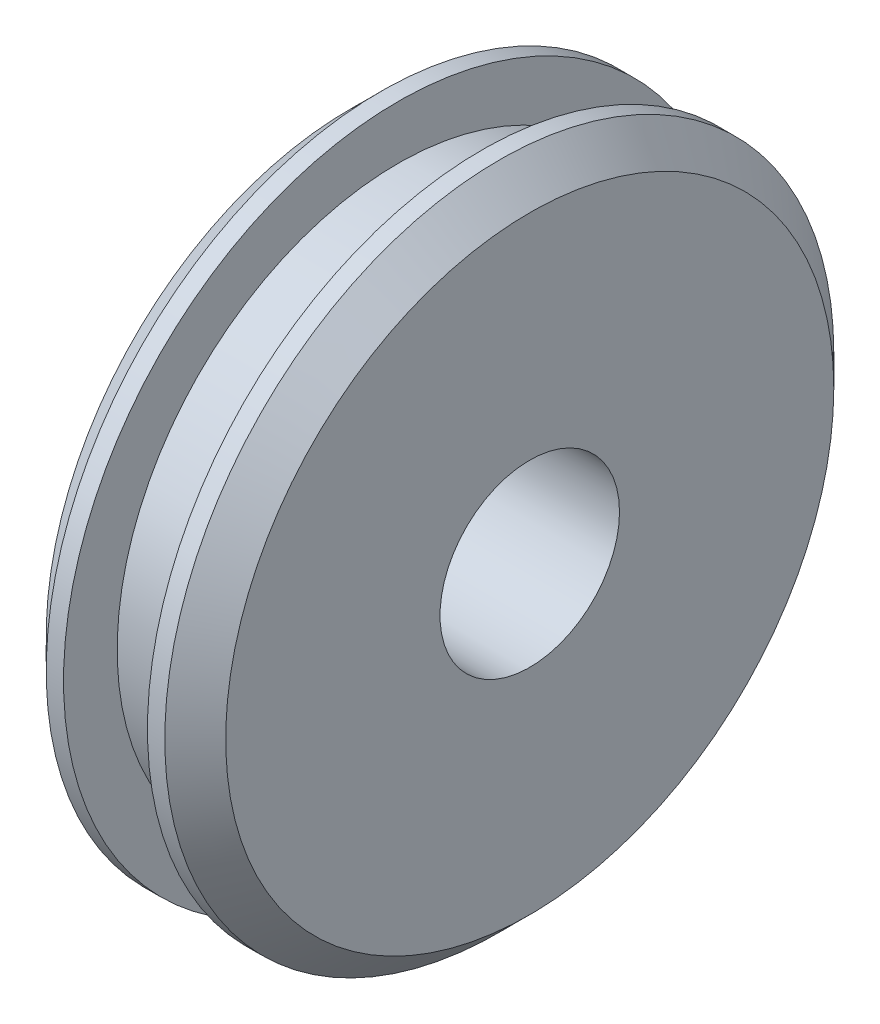
ISO-10303-21;
HEADER;
FILE_DESCRIPTION(('STEP AP214'),'2;1');
FILE_NAME('part.step','',(''),(''),'','','');
FILE_SCHEMA(('AUTOMOTIVE_DESIGN { 1 0 10303 214 1 1 1 1 }'));
ENDSEC;
DATA;
#1=APPLICATION_CONTEXT('core data for automotive mechanical design processes');
#2=APPLICATION_PROTOCOL_DEFINITION('international standard','automotive_design',2000,#1);
#3=PRODUCT_CONTEXT('',#1,'mechanical');
#4=PRODUCT('Part','Part','',(#3));
#5=PRODUCT_RELATED_PRODUCT_CATEGORY('part','',(#4));
#6=PRODUCT_DEFINITION_FORMATION('','',#4);
#7=PRODUCT_DEFINITION_CONTEXT('part definition',#1,'design');
#8=PRODUCT_DEFINITION('design','',#6,#7);
#9=PRODUCT_DEFINITION_SHAPE('','',#8);
#10=(LENGTH_UNIT() NAMED_UNIT(*) SI_UNIT(.MILLI.,.METRE.));
#11=(NAMED_UNIT(*) PLANE_ANGLE_UNIT() SI_UNIT($,.RADIAN.));
#12=(NAMED_UNIT(*) SI_UNIT($,.STERADIAN.) SOLID_ANGLE_UNIT());
#13=UNCERTAINTY_MEASURE_WITH_UNIT(LENGTH_MEASURE(1.E-05),#10,'distance_accuracy_value','');
#14=(GEOMETRIC_REPRESENTATION_CONTEXT(3) GLOBAL_UNCERTAINTY_ASSIGNED_CONTEXT((#13)) GLOBAL_UNIT_ASSIGNED_CONTEXT((#10,
#11,#12)) REPRESENTATION_CONTEXT('',''));
#15=CARTESIAN_POINT('',(0.,0.,0.));
#16=DIRECTION('',(0.,0.,1.));
#17=DIRECTION('',(1.,0.,0.));
#18=AXIS2_PLACEMENT_3D('',#15,#16,#17);
#19=CARTESIAN_POINT('',(0.,17.2096624636307,0.));
#20=DIRECTION('',(1.,0.,0.));
#21=DIRECTION('',(0.,0.,-1.));
#22=AXIS2_PLACEMENT_3D('',#19,#20,#21);
#23=PLANE('',#22);
#24=CARTESIAN_POINT('',(0.,0.,0.));
#25=DIRECTION('',(1.,0.,0.));
#26=DIRECTION('',(0.,0.,-1.));
#27=AXIS2_PLACEMENT_3D('',#24,#25,#26);
#28=CIRCLE('',#27,5.08);
#29=CARTESIAN_POINT('',(0.,0.,-5.08));
#30=VERTEX_POINT('',#29);
#31=EDGE_CURVE('E74',#30,#30,#28,.T.);
#32=ORIENTED_EDGE('',*,*,#31,.F.);
#33=EDGE_LOOP('',(#32));
#34=FACE_BOUND('',#33,.T.);
#35=CARTESIAN_POINT('',(0.,0.,0.));
#36=DIRECTION('',(1.,0.,0.));
#37=DIRECTION('',(0.,0.,-1.));
#38=AXIS2_PLACEMENT_3D('',#35,#36,#37);
#39=CIRCLE('',#38,17.2096624636307);
#40=CARTESIAN_POINT('',(0.,0.,-17.2096624636307));
#41=VERTEX_POINT('',#40);
#42=EDGE_CURVE('E70',#41,#41,#39,.T.);
#43=ORIENTED_EDGE('',*,*,#42,.T.);
#44=EDGE_LOOP('',(#43));
#45=FACE_BOUND('',#44,.T.);
#46=ADVANCED_FACE('F42',(#34,#45),#23,.T.);
#47=CARTESIAN_POINT('',(-10.16,17.2096624636308,0.));
#48=DIRECTION('',(-1.,0.,0.));
#49=DIRECTION('',(0.,0.,1.));
#50=AXIS2_PLACEMENT_3D('',#47,#48,#49);
#51=PLANE('',#50);
#52=CARTESIAN_POINT('',(-10.1599999999999,0.,0.));
#53=DIRECTION('',(1.,0.,0.));
#54=DIRECTION('',(0.,0.,-1.));
#55=AXIS2_PLACEMENT_3D('',#52,#53,#54);
#56=CIRCLE('',#55,5.08);
#57=CARTESIAN_POINT('',(-10.1599999999999,0.,-5.07999999999999));
#58=VERTEX_POINT('',#57);
#59=EDGE_CURVE('E73',#58,#58,#56,.T.);
#60=ORIENTED_EDGE('',*,*,#59,.T.);
#61=EDGE_LOOP('',(#60));
#62=FACE_BOUND('',#61,.T.);
#63=CARTESIAN_POINT('',(-10.1599999999999,0.,0.));
#64=DIRECTION('',(1.,0.,0.));
#65=DIRECTION('',(0.,0.,-1.));
#66=AXIS2_PLACEMENT_3D('',#63,#64,#65);
#67=CIRCLE('',#66,17.2096624636308);
#68=CARTESIAN_POINT('',(-10.1599999999999,0.,-17.2096624636307));
#69=VERTEX_POINT('',#68);
#70=EDGE_CURVE('E12',#69,#69,#67,.T.);
#71=ORIENTED_EDGE('',*,*,#70,.F.);
#72=EDGE_LOOP('',(#71));
#73=FACE_BOUND('',#72,.T.);
#74=ADVANCED_FACE('F80',(#62,#73),#51,.T.);
#75=CARTESIAN_POINT('',(-8.43608250426009,0.,0.));
#76=DIRECTION('',(1.,0.,0.));
#77=DIRECTION('',(0.,0.,-1.));
#78=AXIS2_PLACEMENT_3D('',#75,#76,#77);
#79=CONICAL_SURFACE('',#78,18.9335799593706,0.785398163397461);
#80=ORIENTED_EDGE('',*,*,#70,.T.);
#81=EDGE_LOOP('',(#80));
#82=FACE_BOUND('',#81,.T.);
#83=CARTESIAN_POINT('',(-8.43608250426009,0.,0.));
#84=DIRECTION('',(1.,0.,0.));
#85=DIRECTION('',(0.,0.,-1.));
#86=AXIS2_PLACEMENT_3D('',#83,#84,#85);
#87=CIRCLE('',#86,18.9335799593706);
#88=CARTESIAN_POINT('',(-8.43608250426009,0.,-18.9335799593706));
#89=VERTEX_POINT('',#88);
#90=EDGE_CURVE('E48',#89,#89,#87,.T.);
#91=ORIENTED_EDGE('',*,*,#90,.F.);
#92=EDGE_LOOP('',(#91));
#93=FACE_BOUND('',#92,.T.);
#94=ADVANCED_FACE('F119',(#82,#93),#79,.T.);
#95=CARTESIAN_POINT('',(0.,0.,0.));
#96=DIRECTION('',(1.,0.,0.));
#97=DIRECTION('',(0.,0.,-1.));
#98=AXIS2_PLACEMENT_3D('',#95,#96,#97);
#99=CYLINDRICAL_SURFACE('',#98,18.9335799593706);
#100=ORIENTED_EDGE('',*,*,#90,.T.);
#101=EDGE_LOOP('',(#100));
#102=FACE_BOUND('',#101,.T.);
#103=CARTESIAN_POINT('',(-7.45490000000001,0.,0.));
#104=DIRECTION('',(1.,0.,0.));
#105=DIRECTION('',(0.,0.,-1.));
#106=AXIS2_PLACEMENT_3D('',#103,#104,#105);
#107=CIRCLE('',#106,18.9335799593706);
#108=CARTESIAN_POINT('',(-7.45490000000001,0.,-18.9335799593706));
#109=VERTEX_POINT('',#108);
#110=EDGE_CURVE('E52',#109,#109,#107,.T.);
#111=ORIENTED_EDGE('',*,*,#110,.F.);
#112=EDGE_LOOP('',(#111));
#113=FACE_BOUND('',#112,.T.);
#114=ADVANCED_FACE('F115',(#102,#113),#99,.T.);
#115=CARTESIAN_POINT('',(-7.4549000000001,18.9335799593707,0.));
#116=DIRECTION('',(1.,0.,0.));
#117=DIRECTION('',(0.,0.,-1.));
#118=AXIS2_PLACEMENT_3D('',#115,#116,#117);
#119=PLANE('',#118);
#120=ORIENTED_EDGE('',*,*,#110,.T.);
#121=EDGE_LOOP('',(#120));
#122=FACE_BOUND('',#121,.T.);
#123=CARTESIAN_POINT('',(-7.45489999999999,0.,0.));
#124=DIRECTION('',(1.,0.,0.));
#125=DIRECTION('',(0.,0.,-1.));
#126=AXIS2_PLACEMENT_3D('',#123,#124,#125);
#127=CIRCLE('',#126,15.8982799593706);
#128=CARTESIAN_POINT('',(-7.45489999999999,0.,-15.8982799593706));
#129=VERTEX_POINT('',#128);
#130=EDGE_CURVE('E56',#129,#129,#127,.T.);
#131=ORIENTED_EDGE('',*,*,#130,.F.);
#132=EDGE_LOOP('',(#131));
#133=FACE_BOUND('',#132,.T.);
#134=ADVANCED_FACE('F111',(#122,#133),#119,.T.);
#135=CARTESIAN_POINT('',(0.,0.,0.));
#136=DIRECTION('',(1.,0.,0.));
#137=DIRECTION('',(0.,0.,-1.));
#138=AXIS2_PLACEMENT_3D('',#135,#136,#137);
#139=CYLINDRICAL_SURFACE('',#138,15.8982799593706);
#140=ORIENTED_EDGE('',*,*,#130,.T.);
#141=EDGE_LOOP('',(#140));
#142=FACE_BOUND('',#141,.T.);
#143=CARTESIAN_POINT('',(-2.70509999999999,0.,0.));
#144=DIRECTION('',(1.,0.,0.));
#145=DIRECTION('',(0.,0.,-1.));
#146=AXIS2_PLACEMENT_3D('',#143,#144,#145);
#147=CIRCLE('',#146,15.8982799593706);
#148=CARTESIAN_POINT('',(-2.70509999999999,0.,-15.8982799593706));
#149=VERTEX_POINT('',#148);
#150=EDGE_CURVE('E61',#149,#149,#147,.T.);
#151=ORIENTED_EDGE('',*,*,#150,.F.);
#152=EDGE_LOOP('',(#151));
#153=FACE_BOUND('',#152,.T.);
#154=ADVANCED_FACE('F107',(#142,#153),#139,.T.);
#155=CARTESIAN_POINT('',(-2.70509999999999,15.8982799593707,0.));
#156=DIRECTION('',(-1.,0.,0.));
#157=DIRECTION('',(0.,0.,1.));
#158=AXIS2_PLACEMENT_3D('',#155,#156,#157);
#159=PLANE('',#158);
#160=ORIENTED_EDGE('',*,*,#150,.T.);
#161=EDGE_LOOP('',(#160));
#162=FACE_BOUND('',#161,.T.);
#163=CARTESIAN_POINT('',(-2.70509999999999,0.,0.));
#164=DIRECTION('',(1.,0.,0.));
#165=DIRECTION('',(0.,0.,-1.));
#166=AXIS2_PLACEMENT_3D('',#163,#164,#165);
#167=CIRCLE('',#166,18.9335799593706);
#168=CARTESIAN_POINT('',(-2.70509999999999,0.,-18.9335799593706));
#169=VERTEX_POINT('',#168);
#170=EDGE_CURVE('E64',#169,#169,#167,.T.);
#171=ORIENTED_EDGE('',*,*,#170,.F.);
#172=EDGE_LOOP('',(#171));
#173=FACE_BOUND('',#172,.T.);
#174=ADVANCED_FACE('F101',(#162,#173),#159,.T.);
#175=CARTESIAN_POINT('',(0.,0.,0.));
#176=DIRECTION('',(1.,0.,0.));
#177=DIRECTION('',(0.,0.,-1.));
#178=AXIS2_PLACEMENT_3D('',#175,#176,#177);
#179=CYLINDRICAL_SURFACE('',#178,18.9335799593706);
#180=ORIENTED_EDGE('',*,*,#170,.T.);
#181=EDGE_LOOP('',(#180));
#182=FACE_BOUND('',#181,.T.);
#183=CARTESIAN_POINT('',(-1.72391749573991,0.,0.));
#184=DIRECTION('',(1.,0.,0.));
#185=DIRECTION('',(0.,0.,-1.));
#186=AXIS2_PLACEMENT_3D('',#183,#184,#185);
#187=CIRCLE('',#186,18.9335799593706);
#188=CARTESIAN_POINT('',(-1.72391749573991,0.,-18.9335799593706));
#189=VERTEX_POINT('',#188);
#190=EDGE_CURVE('E67',#189,#189,#187,.T.);
#191=ORIENTED_EDGE('',*,*,#190,.F.);
#192=EDGE_LOOP('',(#191));
#193=FACE_BOUND('',#192,.T.);
#194=ADVANCED_FACE('F95',(#182,#193),#179,.T.);
#195=CARTESIAN_POINT('',(0.,0.,0.));
#196=DIRECTION('',(-1.,0.,0.));
#197=DIRECTION('',(0.,0.,1.));
#198=AXIS2_PLACEMENT_3D('',#195,#196,#197);
#199=CONICAL_SURFACE('',#198,17.2096624636307,0.785398163397453);
#200=ORIENTED_EDGE('',*,*,#190,.T.);
#201=EDGE_LOOP('',(#200));
#202=FACE_BOUND('',#201,.T.);
#203=ORIENTED_EDGE('',*,*,#42,.F.);
#204=EDGE_LOOP('',(#203));
#205=FACE_BOUND('',#204,.T.);
#206=ADVANCED_FACE('F86',(#202,#205),#199,.T.);
#207=CARTESIAN_POINT('',(-10.1599999999999,0.,0.));
#208=DIRECTION('',(1.,0.,0.));
#209=DIRECTION('',(0.,0.,-1.));
#210=AXIS2_PLACEMENT_3D('',#207,#208,#209);
#211=CYLINDRICAL_SURFACE('',#210,5.08);
#212=ORIENTED_EDGE('',*,*,#59,.F.);
#213=EDGE_LOOP('',(#212));
#214=FACE_BOUND('',#213,.T.);
#215=ORIENTED_EDGE('',*,*,#31,.T.);
#216=EDGE_LOOP('',(#215));
#217=FACE_BOUND('',#216,.T.);
#218=ADVANCED_FACE('F83',(#214,#217),#211,.F.);
#219=CLOSED_SHELL('',(#46,#74,#94,#114,#134,#154,#174,#194,#206,#218));
#220=MANIFOLD_SOLID_BREP('B2',#219);
#221=ADVANCED_BREP_SHAPE_REPRESENTATION('',(#18,#220),#14);
#222=SHAPE_DEFINITION_REPRESENTATION(#9,#221);
ENDSEC;
END-ISO-10303-21;
